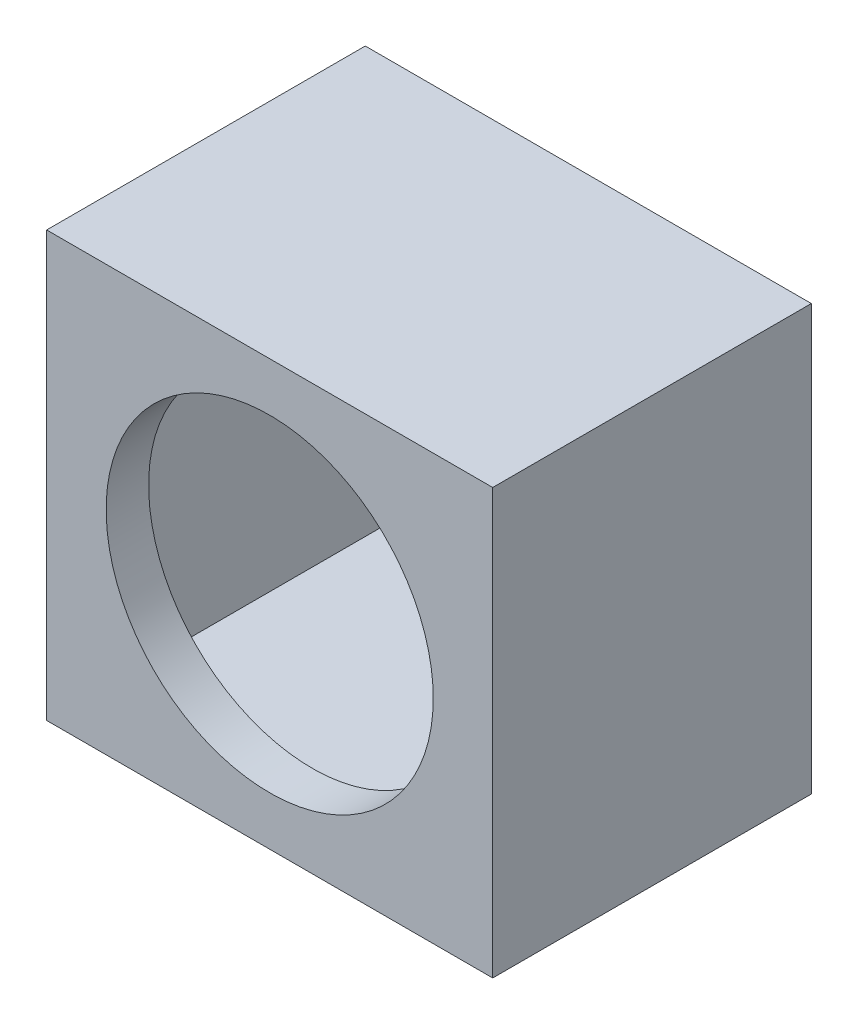
ISO-10303-21;
HEADER;
FILE_DESCRIPTION(('STEP AP214'),'2;1');
FILE_NAME('part.step','',(''),(''),'','','');
FILE_SCHEMA(('AUTOMOTIVE_DESIGN { 1 0 10303 214 1 1 1 1 }'));
ENDSEC;
DATA;
#1=APPLICATION_CONTEXT('core data for automotive mechanical design processes');
#2=APPLICATION_PROTOCOL_DEFINITION('international standard','automotive_design',2000,#1);
#3=PRODUCT_CONTEXT('',#1,'mechanical');
#4=PRODUCT('Part','Part','',(#3));
#5=PRODUCT_RELATED_PRODUCT_CATEGORY('part','',(#4));
#6=PRODUCT_DEFINITION_FORMATION('','',#4);
#7=PRODUCT_DEFINITION_CONTEXT('part definition',#1,'design');
#8=PRODUCT_DEFINITION('design','',#6,#7);
#9=PRODUCT_DEFINITION_SHAPE('','',#8);
#10=(LENGTH_UNIT() NAMED_UNIT(*) SI_UNIT(.MILLI.,.METRE.));
#11=(NAMED_UNIT(*) PLANE_ANGLE_UNIT() SI_UNIT($,.RADIAN.));
#12=(NAMED_UNIT(*) SI_UNIT($,.STERADIAN.) SOLID_ANGLE_UNIT());
#13=UNCERTAINTY_MEASURE_WITH_UNIT(LENGTH_MEASURE(1.E-05),#10,'distance_accuracy_value','');
#14=(GEOMETRIC_REPRESENTATION_CONTEXT(3) GLOBAL_UNCERTAINTY_ASSIGNED_CONTEXT((#13)) GLOBAL_UNIT_ASSIGNED_CONTEXT((#10,
#11,#12)) REPRESENTATION_CONTEXT('',''));
#15=CARTESIAN_POINT('',(0.,0.,0.));
#16=DIRECTION('',(0.,0.,1.));
#17=DIRECTION('',(1.,0.,0.));
#18=AXIS2_PLACEMENT_3D('',#15,#16,#17);
#19=CARTESIAN_POINT('',(0.,0.,0.));
#20=DIRECTION('',(0.,0.,-1.));
#21=DIRECTION('',(-1.,0.,0.));
#22=AXIS2_PLACEMENT_3D('',#19,#20,#21);
#23=PLANE('',#22);
#24=DIRECTION('',(0.,1.,0.));
#25=VECTOR('',#24,1.);
#26=CARTESIAN_POINT('',(5.25,-5.,0.));
#27=LINE('',#26,#25);
#28=CARTESIAN_POINT('',(5.25,-5.,0.));
#29=VERTEX_POINT('',#28);
#30=CARTESIAN_POINT('',(5.25,5.,0.));
#31=VERTEX_POINT('',#30);
#32=EDGE_CURVE('E150',#29,#31,#27,.T.);
#33=ORIENTED_EDGE('',*,*,#32,.F.);
#34=DIRECTION('',(1.,0.,0.));
#35=VECTOR('',#34,1.);
#36=CARTESIAN_POINT('',(-5.25,-5.,0.));
#37=LINE('',#36,#35);
#38=CARTESIAN_POINT('',(-5.25,-5.,0.));
#39=VERTEX_POINT('',#38);
#40=EDGE_CURVE('E102',#39,#29,#37,.T.);
#41=ORIENTED_EDGE('',*,*,#40,.F.);
#42=DIRECTION('',(0.,-1.,0.));
#43=VECTOR('',#42,1.);
#44=CARTESIAN_POINT('',(-5.25,-5.,0.));
#45=LINE('',#44,#43);
#46=CARTESIAN_POINT('',(-5.25,5.,0.));
#47=VERTEX_POINT('',#46);
#48=EDGE_CURVE('E96',#47,#39,#45,.T.);
#49=ORIENTED_EDGE('',*,*,#48,.F.);
#50=DIRECTION('',(-1.,0.,0.));
#51=VECTOR('',#50,1.);
#52=CARTESIAN_POINT('',(-5.25,5.,0.));
#53=LINE('',#52,#51);
#54=EDGE_CURVE('E160',#31,#47,#53,.T.);
#55=ORIENTED_EDGE('',*,*,#54,.F.);
#56=EDGE_LOOP('',(#33,#41,#49,#55));
#57=FACE_BOUND('',#56,.T.);
#58=DIRECTION('',(1.,0.,0.));
#59=VECTOR('',#58,1.);
#60=CARTESIAN_POINT('',(-4.25,-4.,0.));
#61=LINE('',#60,#59);
#62=CARTESIAN_POINT('',(-4.25,-4.,0.));
#63=VERTEX_POINT('',#62);
#64=CARTESIAN_POINT('',(4.25,-4.,0.));
#65=VERTEX_POINT('',#64);
#66=EDGE_CURVE('E139',#63,#65,#61,.T.);
#67=ORIENTED_EDGE('',*,*,#66,.T.);
#68=DIRECTION('',(0.,1.,0.));
#69=VECTOR('',#68,1.);
#70=CARTESIAN_POINT('',(4.25,-4.,0.));
#71=LINE('',#70,#69);
#72=CARTESIAN_POINT('',(4.25,4.,0.));
#73=VERTEX_POINT('',#72);
#74=EDGE_CURVE('E125',#65,#73,#71,.T.);
#75=ORIENTED_EDGE('',*,*,#74,.T.);
#76=DIRECTION('',(-1.,0.,0.));
#77=VECTOR('',#76,1.);
#78=CARTESIAN_POINT('',(-4.25,4.,0.));
#79=LINE('',#78,#77);
#80=CARTESIAN_POINT('',(-4.25,4.,0.));
#81=VERTEX_POINT('',#80);
#82=EDGE_CURVE('E131',#73,#81,#79,.T.);
#83=ORIENTED_EDGE('',*,*,#82,.T.);
#84=DIRECTION('',(0.,-1.,0.));
#85=VECTOR('',#84,1.);
#86=CARTESIAN_POINT('',(-4.25,-4.,0.));
#87=LINE('',#86,#85);
#88=EDGE_CURVE('E137',#81,#63,#87,.T.);
#89=ORIENTED_EDGE('',*,*,#88,.T.);
#90=EDGE_LOOP('',(#67,#75,#83,#89));
#91=FACE_BOUND('',#90,.T.);
#92=ADVANCED_FACE('F34',(#57,#91),#23,.T.);
#93=CARTESIAN_POINT('',(5.25,-5.,7.5));
#94=DIRECTION('',(-1.,0.,0.));
#95=DIRECTION('',(0.,0.,1.));
#96=AXIS2_PLACEMENT_3D('',#93,#94,#95);
#97=PLANE('',#96);
#98=ORIENTED_EDGE('',*,*,#32,.T.);
#99=DIRECTION('',(0.,0.,-1.));
#100=VECTOR('',#99,1.);
#101=CARTESIAN_POINT('',(5.25,5.,7.5));
#102=LINE('',#101,#100);
#103=CARTESIAN_POINT('',(5.25,5.,7.5));
#104=VERTEX_POINT('',#103);
#105=EDGE_CURVE('E169',#104,#31,#102,.T.);
#106=ORIENTED_EDGE('',*,*,#105,.F.);
#107=DIRECTION('',(0.,1.,0.));
#108=VECTOR('',#107,1.);
#109=CARTESIAN_POINT('',(5.25,-5.,7.5));
#110=LINE('',#109,#108);
#111=CARTESIAN_POINT('',(5.25,-5.,7.5));
#112=VERTEX_POINT('',#111);
#113=EDGE_CURVE('E151',#112,#104,#110,.T.);
#114=ORIENTED_EDGE('',*,*,#113,.F.);
#115=DIRECTION('',(0.,0.,-1.));
#116=VECTOR('',#115,1.);
#117=CARTESIAN_POINT('',(5.25,-5.,7.5));
#118=LINE('',#117,#116);
#119=EDGE_CURVE('E157',#112,#29,#118,.T.);
#120=ORIENTED_EDGE('',*,*,#119,.T.);
#121=EDGE_LOOP('',(#98,#106,#114,#120));
#122=FACE_BOUND('',#121,.T.);
#123=ADVANCED_FACE('F187',(#122),#97,.F.);
#124=CARTESIAN_POINT('',(-5.25,5.,7.5));
#125=DIRECTION('',(0.,-1.,0.));
#126=DIRECTION('',(0.,0.,-1.));
#127=AXIS2_PLACEMENT_3D('',#124,#125,#126);
#128=PLANE('',#127);
#129=ORIENTED_EDGE('',*,*,#54,.T.);
#130=DIRECTION('',(0.,0.,-1.));
#131=VECTOR('',#130,1.);
#132=CARTESIAN_POINT('',(-5.25,5.,7.5));
#133=LINE('',#132,#131);
#134=CARTESIAN_POINT('',(-5.25,5.,7.5));
#135=VERTEX_POINT('',#134);
#136=EDGE_CURVE('E167',#135,#47,#133,.T.);
#137=ORIENTED_EDGE('',*,*,#136,.F.);
#138=DIRECTION('',(-1.,0.,0.));
#139=VECTOR('',#138,1.);
#140=CARTESIAN_POINT('',(-5.25,5.,7.5));
#141=LINE('',#140,#139);
#142=EDGE_CURVE('E110',#104,#135,#141,.T.);
#143=ORIENTED_EDGE('',*,*,#142,.F.);
#144=ORIENTED_EDGE('',*,*,#105,.T.);
#145=EDGE_LOOP('',(#129,#137,#143,#144));
#146=FACE_BOUND('',#145,.T.);
#147=ADVANCED_FACE('F193',(#146),#128,.F.);
#148=CARTESIAN_POINT('',(-5.25,-5.,7.5));
#149=DIRECTION('',(1.,0.,0.));
#150=DIRECTION('',(0.,0.,-1.));
#151=AXIS2_PLACEMENT_3D('',#148,#149,#150);
#152=PLANE('',#151);
#153=ORIENTED_EDGE('',*,*,#48,.T.);
#154=DIRECTION('',(0.,0.,-1.));
#155=VECTOR('',#154,1.);
#156=CARTESIAN_POINT('',(-5.25,-5.,7.5));
#157=LINE('',#156,#155);
#158=CARTESIAN_POINT('',(-5.25,-5.,7.5));
#159=VERTEX_POINT('',#158);
#160=EDGE_CURVE('E165',#159,#39,#157,.T.);
#161=ORIENTED_EDGE('',*,*,#160,.F.);
#162=DIRECTION('',(0.,-1.,0.));
#163=VECTOR('',#162,1.);
#164=CARTESIAN_POINT('',(-5.25,-5.,7.5));
#165=LINE('',#164,#163);
#166=EDGE_CURVE('E154',#135,#159,#165,.T.);
#167=ORIENTED_EDGE('',*,*,#166,.F.);
#168=ORIENTED_EDGE('',*,*,#136,.T.);
#169=EDGE_LOOP('',(#153,#161,#167,#168));
#170=FACE_BOUND('',#169,.T.);
#171=ADVANCED_FACE('F204',(#170),#152,.F.);
#172=CARTESIAN_POINT('',(-5.25,-5.,7.5));
#173=DIRECTION('',(0.,1.,0.));
#174=DIRECTION('',(0.,0.,1.));
#175=AXIS2_PLACEMENT_3D('',#172,#173,#174);
#176=PLANE('',#175);
#177=ORIENTED_EDGE('',*,*,#40,.T.);
#178=ORIENTED_EDGE('',*,*,#119,.F.);
#179=DIRECTION('',(1.,0.,0.));
#180=VECTOR('',#179,1.);
#181=CARTESIAN_POINT('',(-5.25,-5.,7.5));
#182=LINE('',#181,#180);
#183=EDGE_CURVE('E78',#159,#112,#182,.T.);
#184=ORIENTED_EDGE('',*,*,#183,.F.);
#185=ORIENTED_EDGE('',*,*,#160,.T.);
#186=EDGE_LOOP('',(#177,#178,#184,#185));
#187=FACE_BOUND('',#186,.T.);
#188=ADVANCED_FACE('F201',(#187),#176,.F.);
#189=CARTESIAN_POINT('',(0.,0.,7.5));
#190=DIRECTION('',(0.,0.,-1.));
#191=DIRECTION('',(-1.,0.,0.));
#192=AXIS2_PLACEMENT_3D('',#189,#190,#191);
#193=PLANE('',#192);
#194=CARTESIAN_POINT('',(0.,0.,7.5));
#195=DIRECTION('',(0.,0.,1.));
#196=DIRECTION('',(1.,0.,0.));
#197=AXIS2_PLACEMENT_3D('',#194,#195,#196);
#198=CIRCLE('',#197,3.85);
#199=CARTESIAN_POINT('',(3.85,0.,7.5));
#200=VERTEX_POINT('',#199);
#201=EDGE_CURVE('E147',#200,#200,#198,.T.);
#202=ORIENTED_EDGE('',*,*,#201,.F.);
#203=EDGE_LOOP('',(#202));
#204=FACE_BOUND('',#203,.T.);
#205=ORIENTED_EDGE('',*,*,#113,.T.);
#206=ORIENTED_EDGE('',*,*,#142,.T.);
#207=ORIENTED_EDGE('',*,*,#166,.T.);
#208=ORIENTED_EDGE('',*,*,#183,.T.);
#209=EDGE_LOOP('',(#205,#206,#207,#208));
#210=FACE_BOUND('',#209,.T.);
#211=ADVANCED_FACE('F199',(#204,#210),#193,.F.);
#212=CARTESIAN_POINT('',(0.,0.,-0.00100000000000013));
#213=DIRECTION('',(0.,0.,1.));
#214=DIRECTION('',(1.,0.,0.));
#215=AXIS2_PLACEMENT_3D('',#212,#213,#214);
#216=CYLINDRICAL_SURFACE('',#215,3.85);
#217=CARTESIAN_POINT('',(0.,0.,6.5));
#218=DIRECTION('',(0.,0.,-1.));
#219=DIRECTION('',(-1.,0.,0.));
#220=AXIS2_PLACEMENT_3D('',#217,#218,#219);
#221=CIRCLE('',#220,3.85);
#222=CARTESIAN_POINT('',(3.85,0.,6.5));
#223=VERTEX_POINT('',#222);
#224=EDGE_CURVE('E144',#223,#223,#221,.F.);
#225=CARTESIAN_POINT('',(3.85,0.,6.5));
#226=CARTESIAN_POINT('',(3.85,0.,6.51041666666667));
#227=CARTESIAN_POINT('',(3.85,0.,6.52083333333333));
#228=CARTESIAN_POINT('',(3.85,0.,6.54166666666667));
#229=CARTESIAN_POINT('',(3.85,0.,6.55208333333333));
#230=CARTESIAN_POINT('',(3.85,0.,6.57291666666667));
#231=CARTESIAN_POINT('',(3.85,0.,6.58333333333333));
#232=CARTESIAN_POINT('',(3.85,0.,6.60416666666667));
#233=CARTESIAN_POINT('',(3.85,0.,6.61458333333333));
#234=CARTESIAN_POINT('',(3.85,0.,6.63541666666667));
#235=CARTESIAN_POINT('',(3.85,0.,6.64583333333333));
#236=CARTESIAN_POINT('',(3.85,0.,6.66666666666667));
#237=CARTESIAN_POINT('',(3.85,0.,6.67708333333333));
#238=CARTESIAN_POINT('',(3.85,0.,6.69791666666667));
#239=CARTESIAN_POINT('',(3.85,0.,6.70833333333333));
#240=CARTESIAN_POINT('',(3.85,0.,6.72916666666667));
#241=CARTESIAN_POINT('',(3.85,0.,6.73958333333333));
#242=CARTESIAN_POINT('',(3.85,0.,6.76041666666667));
#243=CARTESIAN_POINT('',(3.85,0.,6.77083333333333));
#244=CARTESIAN_POINT('',(3.85,0.,6.79166666666667));
#245=CARTESIAN_POINT('',(3.85,0.,6.80208333333333));
#246=CARTESIAN_POINT('',(3.85,0.,6.82291666666667));
#247=CARTESIAN_POINT('',(3.85,0.,6.83333333333333));
#248=CARTESIAN_POINT('',(3.85,0.,6.85416666666667));
#249=CARTESIAN_POINT('',(3.85,0.,6.86458333333333));
#250=CARTESIAN_POINT('',(3.85,0.,6.88541666666667));
#251=CARTESIAN_POINT('',(3.85,0.,6.89583333333333));
#252=CARTESIAN_POINT('',(3.85,0.,6.91666666666667));
#253=CARTESIAN_POINT('',(3.85,0.,6.92708333333333));
#254=CARTESIAN_POINT('',(3.85,0.,6.94791666666667));
#255=CARTESIAN_POINT('',(3.85,0.,6.95833333333333));
#256=CARTESIAN_POINT('',(3.85,0.,6.97916666666667));
#257=CARTESIAN_POINT('',(3.85,0.,6.98958333333333));
#258=CARTESIAN_POINT('',(3.85,0.,7.01041666666667));
#259=CARTESIAN_POINT('',(3.85,0.,7.02083333333333));
#260=CARTESIAN_POINT('',(3.85,0.,7.04166666666667));
#261=CARTESIAN_POINT('',(3.85,0.,7.05208333333333));
#262=CARTESIAN_POINT('',(3.85,0.,7.07291666666667));
#263=CARTESIAN_POINT('',(3.85,0.,7.08333333333333));
#264=CARTESIAN_POINT('',(3.85,0.,7.10416666666667));
#265=CARTESIAN_POINT('',(3.85,0.,7.11458333333333));
#266=CARTESIAN_POINT('',(3.85,0.,7.13541666666667));
#267=CARTESIAN_POINT('',(3.85,0.,7.14583333333333));
#268=CARTESIAN_POINT('',(3.85,0.,7.16666666666667));
#269=CARTESIAN_POINT('',(3.85,0.,7.17708333333333));
#270=CARTESIAN_POINT('',(3.85,0.,7.19791666666667));
#271=CARTESIAN_POINT('',(3.85,0.,7.20833333333333));
#272=CARTESIAN_POINT('',(3.85,0.,7.22916666666667));
#273=CARTESIAN_POINT('',(3.85,0.,7.23958333333333));
#274=CARTESIAN_POINT('',(3.85,0.,7.26041666666667));
#275=CARTESIAN_POINT('',(3.85,0.,7.27083333333333));
#276=CARTESIAN_POINT('',(3.85,0.,7.29166666666667));
#277=CARTESIAN_POINT('',(3.85,0.,7.30208333333333));
#278=CARTESIAN_POINT('',(3.85,0.,7.32291666666667));
#279=CARTESIAN_POINT('',(3.85,0.,7.33333333333333));
#280=CARTESIAN_POINT('',(3.85,0.,7.35416666666667));
#281=CARTESIAN_POINT('',(3.85,0.,7.36458333333333));
#282=CARTESIAN_POINT('',(3.85,0.,7.38541666666667));
#283=CARTESIAN_POINT('',(3.85,0.,7.39583333333333));
#284=CARTESIAN_POINT('',(3.85,0.,7.41666666666667));
#285=CARTESIAN_POINT('',(3.85,0.,7.42708333333333));
#286=CARTESIAN_POINT('',(3.85,0.,7.44791666666667));
#287=CARTESIAN_POINT('',(3.85,0.,7.45833333333333));
#288=CARTESIAN_POINT('',(3.85,0.,7.47916666666667));
#289=CARTESIAN_POINT('',(3.85,0.,7.48958333333333));
#290=CARTESIAN_POINT('',(3.85,0.,7.5));
#291=B_SPLINE_CURVE_WITH_KNOTS('',3,(#225,#226,#227,#228,#229,#230,#231,#232,#233,#234,#235,
#236,#237,#238,#239,#240,#241,#242,#243,#244,#245,#246,#247,#248,#249,#250,#251,#252,#253,#254,
#255,#256,#257,#258,#259,#260,#261,#262,#263,#264,#265,#266,#267,#268,#269,#270,#271,#272,#273,
#274,#275,#276,#277,#278,#279,#280,#281,#282,#283,#284,#285,#286,#287,#288,#289,#290),
.UNSPECIFIED.,.F.,.F.,(4,2,2,2,2,2,2,2,2,2,2,2,2,2,2,2,2,2,2,2,2,2,2,2,2,2,2,2,2,2,2,2,4),(0.,
0.03125,0.0625000000000001,0.0937500000000001,0.125,0.15625,0.1875,0.21875,0.25,
0.281249999999999,0.312499999999999,0.343749999999999,0.374999999999999,0.40625,0.4375,0.46875,
0.5,0.53125,0.5625,0.59375,0.625,0.65625,0.6875,0.718749999999999,0.749999999999999,
0.781249999999999,0.812499999999999,0.843749999999999,0.874999999999999,0.906249999999999,
0.937499999999999,0.968749999999999,0.999999999999999),.UNSPECIFIED.);
#292=EDGE_CURVE('BSEAM211',#223,#200,#291,.T.);
#293=ORIENTED_EDGE('',*,*,#224,.F.);
#294=ORIENTED_EDGE('',*,*,#201,.T.);
#295=ORIENTED_EDGE('',*,*,#292,.T.);
#296=ORIENTED_EDGE('',*,*,#292,.F.);
#297=EDGE_LOOP('',(#293,#295,#294,#296));
#298=FACE_BOUND('',#297,.T.);
#299=ADVANCED_FACE('F211',(#298),#216,.F.);
#300=CARTESIAN_POINT('',(4.25,-5.,7.5));
#301=DIRECTION('',(-1.,0.,0.));
#302=DIRECTION('',(0.,0.,1.));
#303=AXIS2_PLACEMENT_3D('',#300,#301,#302);
#304=PLANE('',#303);
#305=DIRECTION('',(0.,0.,-1.));
#306=VECTOR('',#305,1.);
#307=CARTESIAN_POINT('',(4.25,4.,7.5));
#308=LINE('',#307,#306);
#309=CARTESIAN_POINT('',(4.25,4.,6.5));
#310=VERTEX_POINT('',#309);
#311=EDGE_CURVE('E121',#310,#73,#308,.T.);
#312=ORIENTED_EDGE('',*,*,#311,.T.);
#313=ORIENTED_EDGE('',*,*,#74,.F.);
#314=DIRECTION('',(0.,0.,-1.));
#315=VECTOR('',#314,1.);
#316=CARTESIAN_POINT('',(4.25,-4.,7.5));
#317=LINE('',#316,#315);
#318=CARTESIAN_POINT('',(4.25,-4.,6.5));
#319=VERTEX_POINT('',#318);
#320=EDGE_CURVE('E38',#319,#65,#317,.T.);
#321=ORIENTED_EDGE('',*,*,#320,.F.);
#322=DIRECTION('',(0.,1.,0.));
#323=VECTOR('',#322,1.);
#324=CARTESIAN_POINT('',(4.25,0.,6.5));
#325=LINE('',#324,#323);
#326=EDGE_CURVE('E127',#319,#310,#325,.T.);
#327=ORIENTED_EDGE('',*,*,#326,.T.);
#328=EDGE_LOOP('',(#312,#313,#321,#327));
#329=FACE_BOUND('',#328,.T.);
#330=ADVANCED_FACE('F123',(#329),#304,.T.);
#331=CARTESIAN_POINT('',(-5.25,4.,7.5));
#332=DIRECTION('',(0.,-1.,0.));
#333=DIRECTION('',(0.,0.,-1.));
#334=AXIS2_PLACEMENT_3D('',#331,#332,#333);
#335=PLANE('',#334);
#336=DIRECTION('',(0.,0.,-1.));
#337=VECTOR('',#336,1.);
#338=CARTESIAN_POINT('',(-4.25,4.,7.5));
#339=LINE('',#338,#337);
#340=CARTESIAN_POINT('',(-4.25,4.,6.5));
#341=VERTEX_POINT('',#340);
#342=EDGE_CURVE('E129',#341,#81,#339,.T.);
#343=ORIENTED_EDGE('',*,*,#342,.T.);
#344=ORIENTED_EDGE('',*,*,#82,.F.);
#345=ORIENTED_EDGE('',*,*,#311,.F.);
#346=DIRECTION('',(-1.,0.,0.));
#347=VECTOR('',#346,1.);
#348=CARTESIAN_POINT('',(0.,4.,6.5));
#349=LINE('',#348,#347);
#350=EDGE_CURVE('E69',#310,#341,#349,.T.);
#351=ORIENTED_EDGE('',*,*,#350,.T.);
#352=EDGE_LOOP('',(#343,#344,#345,#351));
#353=FACE_BOUND('',#352,.T.);
#354=ADVANCED_FACE('F132',(#353),#335,.T.);
#355=CARTESIAN_POINT('',(-4.25,-5.,7.5));
#356=DIRECTION('',(1.,0.,0.));
#357=DIRECTION('',(0.,0.,-1.));
#358=AXIS2_PLACEMENT_3D('',#355,#356,#357);
#359=PLANE('',#358);
#360=DIRECTION('',(0.,0.,-1.));
#361=VECTOR('',#360,1.);
#362=CARTESIAN_POINT('',(-4.25,-4.,7.5));
#363=LINE('',#362,#361);
#364=CARTESIAN_POINT('',(-4.25,-4.,6.5));
#365=VERTEX_POINT('',#364);
#366=EDGE_CURVE('E174',#365,#63,#363,.T.);
#367=ORIENTED_EDGE('',*,*,#366,.T.);
#368=ORIENTED_EDGE('',*,*,#88,.F.);
#369=ORIENTED_EDGE('',*,*,#342,.F.);
#370=DIRECTION('',(0.,-1.,0.));
#371=VECTOR('',#370,1.);
#372=CARTESIAN_POINT('',(-4.25,0.,6.5));
#373=LINE('',#372,#371);
#374=EDGE_CURVE('E43',#341,#365,#373,.T.);
#375=ORIENTED_EDGE('',*,*,#374,.T.);
#376=EDGE_LOOP('',(#367,#368,#369,#375));
#377=FACE_BOUND('',#376,.T.);
#378=ADVANCED_FACE('F177',(#377),#359,.T.);
#379=CARTESIAN_POINT('',(-5.25,-4.,7.5));
#380=DIRECTION('',(0.,1.,0.));
#381=DIRECTION('',(0.,0.,1.));
#382=AXIS2_PLACEMENT_3D('',#379,#380,#381);
#383=PLANE('',#382);
#384=ORIENTED_EDGE('',*,*,#320,.T.);
#385=ORIENTED_EDGE('',*,*,#66,.F.);
#386=ORIENTED_EDGE('',*,*,#366,.F.);
#387=DIRECTION('',(1.,0.,0.));
#388=VECTOR('',#387,1.);
#389=CARTESIAN_POINT('',(0.,-4.,6.5));
#390=LINE('',#389,#388);
#391=EDGE_CURVE('E11',#365,#319,#390,.T.);
#392=ORIENTED_EDGE('',*,*,#391,.T.);
#393=EDGE_LOOP('',(#384,#385,#386,#392));
#394=FACE_BOUND('',#393,.T.);
#395=ADVANCED_FACE('F178',(#394),#383,.T.);
#396=CARTESIAN_POINT('',(0.,0.,6.5));
#397=DIRECTION('',(0.,0.,-1.));
#398=DIRECTION('',(-1.,0.,0.));
#399=AXIS2_PLACEMENT_3D('',#396,#397,#398);
#400=PLANE('',#399);
#401=ORIENTED_EDGE('',*,*,#224,.T.);
#402=EDGE_LOOP('',(#401));
#403=FACE_BOUND('',#402,.T.);
#404=ORIENTED_EDGE('',*,*,#326,.F.);
#405=ORIENTED_EDGE('',*,*,#391,.F.);
#406=ORIENTED_EDGE('',*,*,#374,.F.);
#407=ORIENTED_EDGE('',*,*,#350,.F.);
#408=EDGE_LOOP('',(#404,#405,#406,#407));
#409=FACE_BOUND('',#408,.T.);
#410=ADVANCED_FACE('F36',(#403,#409),#400,.T.);
#411=CLOSED_SHELL('',(#92,#123,#147,#171,#188,#211,#299,#330,#354,#378,#395,#410));
#412=MANIFOLD_SOLID_BREP('B2',#411);
#413=ADVANCED_BREP_SHAPE_REPRESENTATION('',(#18,#412),#14);
#414=SHAPE_DEFINITION_REPRESENTATION(#9,#413);
ENDSEC;
END-ISO-10303-21;
